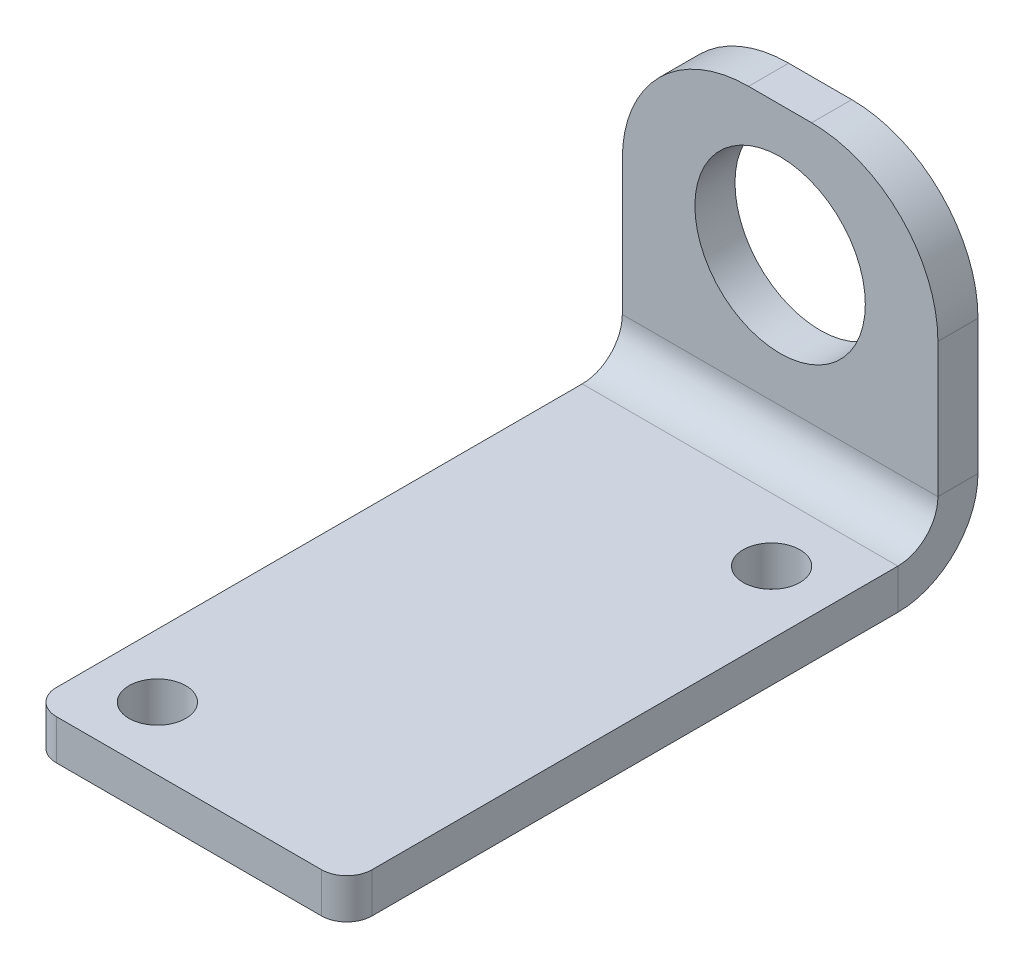
ISO-10303-21;
HEADER;
FILE_DESCRIPTION(('STEP AP214'),'2;1');
FILE_NAME('part.step','',(''),(''),'','','');
FILE_SCHEMA(('AUTOMOTIVE_DESIGN { 1 0 10303 214 1 1 1 1 }'));
ENDSEC;
DATA;
#1=APPLICATION_CONTEXT('core data for automotive mechanical design processes');
#2=APPLICATION_PROTOCOL_DEFINITION('international standard','automotive_design',2000,#1);
#3=PRODUCT_CONTEXT('',#1,'mechanical');
#4=PRODUCT('Part','Part','',(#3));
#5=PRODUCT_RELATED_PRODUCT_CATEGORY('part','',(#4));
#6=PRODUCT_DEFINITION_FORMATION('','',#4);
#7=PRODUCT_DEFINITION_CONTEXT('part definition',#1,'design');
#8=PRODUCT_DEFINITION('design','',#6,#7);
#9=PRODUCT_DEFINITION_SHAPE('','',#8);
#10=(LENGTH_UNIT() NAMED_UNIT(*) SI_UNIT(.MILLI.,.METRE.));
#11=(NAMED_UNIT(*) PLANE_ANGLE_UNIT() SI_UNIT($,.RADIAN.));
#12=(NAMED_UNIT(*) SI_UNIT($,.STERADIAN.) SOLID_ANGLE_UNIT());
#13=UNCERTAINTY_MEASURE_WITH_UNIT(LENGTH_MEASURE(1.E-05),#10,'distance_accuracy_value','');
#14=(GEOMETRIC_REPRESENTATION_CONTEXT(3) GLOBAL_UNCERTAINTY_ASSIGNED_CONTEXT((#13)) GLOBAL_UNIT_ASSIGNED_CONTEXT((#10,
#11,#12)) REPRESENTATION_CONTEXT('',''));
#15=CARTESIAN_POINT('',(0.,0.,0.));
#16=DIRECTION('',(0.,0.,1.));
#17=DIRECTION('',(1.,0.,0.));
#18=AXIS2_PLACEMENT_3D('',#15,#16,#17);
#19=CARTESIAN_POINT('',(-12.5,-3.175,0.));
#20=DIRECTION('',(-1.,0.,0.));
#21=DIRECTION('',(0.,0.,1.));
#22=AXIS2_PLACEMENT_3D('',#19,#20,#21);
#23=PLANE('',#22);
#24=DIRECTION('',(0.,0.,1.));
#25=VECTOR('',#24,1.);
#26=CARTESIAN_POINT('',(-12.5,-3.175,0.));
#27=LINE('',#26,#25);
#28=CARTESIAN_POINT('',(-12.5,-3.17500000000003,-43.65));
#29=VERTEX_POINT('',#28);
#30=CARTESIAN_POINT('',(-12.5,-3.175,-2.));
#31=VERTEX_POINT('',#30);
#32=EDGE_CURVE('E222',#29,#31,#27,.T.);
#33=ORIENTED_EDGE('',*,*,#32,.T.);
#34=DIRECTION('',(0.,1.,0.));
#35=VECTOR('',#34,1.);
#36=CARTESIAN_POINT('',(-12.5,-3.175,-2.));
#37=LINE('',#36,#35);
#38=CARTESIAN_POINT('',(-12.5,0.,-2.));
#39=VERTEX_POINT('',#38);
#40=EDGE_CURVE('E13',#31,#39,#37,.T.);
#41=ORIENTED_EDGE('',*,*,#40,.T.);
#42=DIRECTION('',(0.,0.,1.));
#43=VECTOR('',#42,1.);
#44=CARTESIAN_POINT('',(-12.5,0.,0.));
#45=LINE('',#44,#43);
#46=CARTESIAN_POINT('',(-12.5,0.,-43.65));
#47=VERTEX_POINT('',#46);
#48=EDGE_CURVE('E220',#47,#39,#45,.T.);
#49=ORIENTED_EDGE('',*,*,#48,.F.);
#50=DIRECTION('',(0.,-1.,0.));
#51=VECTOR('',#50,1.);
#52=CARTESIAN_POINT('',(-12.5,0.,-43.65));
#53=LINE('',#52,#51);
#54=EDGE_CURVE('E209',#47,#29,#53,.T.);
#55=ORIENTED_EDGE('',*,*,#54,.T.);
#56=EDGE_LOOP('',(#33,#41,#49,#55));
#57=FACE_BOUND('',#56,.T.);
#58=ADVANCED_FACE('F61',(#57),#23,.T.);
#59=CARTESIAN_POINT('',(0.,-3.175,0.));
#60=DIRECTION('',(0.,-1.,0.));
#61=DIRECTION('',(0.,0.,-1.));
#62=AXIS2_PLACEMENT_3D('',#59,#60,#61);
#63=PLANE('',#62);
#64=CARTESIAN_POINT('',(-7.5,-3.17500000000003,-5.));
#65=DIRECTION('',(0.,1.,0.));
#66=DIRECTION('',(0.,0.,1.));
#67=AXIS2_PLACEMENT_3D('',#64,#65,#66);
#68=CIRCLE('',#67,2.25);
#69=CARTESIAN_POINT('',(-7.5,-3.17500000000003,-2.75));
#70=VERTEX_POINT('',#69);
#71=EDGE_CURVE('E317',#70,#70,#68,.T.);
#72=ORIENTED_EDGE('',*,*,#71,.T.);
#73=EDGE_LOOP('',(#72));
#74=FACE_BOUND('',#73,.T.);
#75=CARTESIAN_POINT('',(7.5,-3.17500000000003,-38.65));
#76=DIRECTION('',(0.,1.,0.));
#77=DIRECTION('',(0.,0.,1.));
#78=AXIS2_PLACEMENT_3D('',#75,#76,#77);
#79=CIRCLE('',#78,2.25);
#80=CARTESIAN_POINT('',(7.5,-3.17500000000003,-36.4));
#81=VERTEX_POINT('',#80);
#82=EDGE_CURVE('E311',#81,#81,#79,.T.);
#83=ORIENTED_EDGE('',*,*,#82,.T.);
#84=EDGE_LOOP('',(#83));
#85=FACE_BOUND('',#84,.T.);
#86=DIRECTION('',(0.,0.,-1.));
#87=VECTOR('',#86,1.);
#88=CARTESIAN_POINT('',(12.5,-3.175,0.));
#89=LINE('',#88,#87);
#90=CARTESIAN_POINT('',(12.5,-3.175,-2.));
#91=VERTEX_POINT('',#90);
#92=CARTESIAN_POINT('',(12.5,-3.175,-43.65));
#93=VERTEX_POINT('',#92);
#94=EDGE_CURVE('E228',#91,#93,#89,.T.);
#95=ORIENTED_EDGE('',*,*,#94,.F.);
#96=CARTESIAN_POINT('',(10.5,-3.175,-2.));
#97=DIRECTION('',(0.,-1.,0.));
#98=DIRECTION('',(0.,0.,-1.));
#99=AXIS2_PLACEMENT_3D('',#96,#97,#98);
#100=CIRCLE('',#99,2.);
#101=CARTESIAN_POINT('',(10.5,-3.175,0.));
#102=VERTEX_POINT('',#101);
#103=EDGE_CURVE('E69',#91,#102,#100,.T.);
#104=ORIENTED_EDGE('',*,*,#103,.T.);
#105=DIRECTION('',(1.,0.,0.));
#106=VECTOR('',#105,1.);
#107=CARTESIAN_POINT('',(-12.5,-3.175,0.));
#108=LINE('',#107,#106);
#109=CARTESIAN_POINT('',(-10.5,-3.175,0.));
#110=VERTEX_POINT('',#109);
#111=EDGE_CURVE('E224',#110,#102,#108,.T.);
#112=ORIENTED_EDGE('',*,*,#111,.F.);
#113=CARTESIAN_POINT('',(-10.5,-3.175,-2.));
#114=DIRECTION('',(0.,-1.,0.));
#115=DIRECTION('',(0.,0.,-1.));
#116=AXIS2_PLACEMENT_3D('',#113,#114,#115);
#117=CIRCLE('',#116,2.);
#118=EDGE_CURVE('E76',#110,#31,#117,.T.);
#119=ORIENTED_EDGE('',*,*,#118,.T.);
#120=ORIENTED_EDGE('',*,*,#32,.F.);
#121=DIRECTION('',(-1.,0.,0.));
#122=VECTOR('',#121,1.);
#123=CARTESIAN_POINT('',(-12.5,-3.17500000000003,-43.65));
#124=LINE('',#123,#122);
#125=EDGE_CURVE('E161',#29,#93,#124,.F.);
#126=ORIENTED_EDGE('',*,*,#125,.T.);
#127=EDGE_LOOP('',(#95,#104,#112,#119,#120,#126));
#128=FACE_BOUND('',#127,.T.);
#129=ADVANCED_FACE('F264',(#74,#85,#128),#63,.T.);
#130=CARTESIAN_POINT('',(0.,0.,0.));
#131=DIRECTION('',(0.,-1.,0.));
#132=DIRECTION('',(0.,0.,-1.));
#133=AXIS2_PLACEMENT_3D('',#130,#131,#132);
#134=PLANE('',#133);
#135=CARTESIAN_POINT('',(-7.5,0.,-5.));
#136=DIRECTION('',(0.,1.,0.));
#137=DIRECTION('',(0.,0.,1.));
#138=AXIS2_PLACEMENT_3D('',#135,#136,#137);
#139=CIRCLE('',#138,2.25);
#140=CARTESIAN_POINT('',(-7.5,0.,-2.75));
#141=VERTEX_POINT('',#140);
#142=EDGE_CURVE('E320',#141,#141,#139,.T.);
#143=ORIENTED_EDGE('',*,*,#142,.F.);
#144=EDGE_LOOP('',(#143));
#145=FACE_BOUND('',#144,.T.);
#146=CARTESIAN_POINT('',(7.5,0.,-38.65));
#147=DIRECTION('',(0.,1.,0.));
#148=DIRECTION('',(0.,0.,1.));
#149=AXIS2_PLACEMENT_3D('',#146,#147,#148);
#150=CIRCLE('',#149,2.25);
#151=CARTESIAN_POINT('',(7.5,0.,-36.4));
#152=VERTEX_POINT('',#151);
#153=EDGE_CURVE('E314',#152,#152,#150,.T.);
#154=ORIENTED_EDGE('',*,*,#153,.F.);
#155=EDGE_LOOP('',(#154));
#156=FACE_BOUND('',#155,.T.);
#157=DIRECTION('',(1.,0.,0.));
#158=VECTOR('',#157,1.);
#159=CARTESIAN_POINT('',(-12.5,0.,0.));
#160=LINE('',#159,#158);
#161=CARTESIAN_POINT('',(-10.5,0.,0.));
#162=VERTEX_POINT('',#161);
#163=CARTESIAN_POINT('',(10.5,0.,0.));
#164=VERTEX_POINT('',#163);
#165=EDGE_CURVE('E233',#162,#164,#160,.T.);
#166=ORIENTED_EDGE('',*,*,#165,.T.);
#167=CARTESIAN_POINT('',(10.5,0.,-2.));
#168=DIRECTION('',(0.,-1.,0.));
#169=DIRECTION('',(0.,0.,-1.));
#170=AXIS2_PLACEMENT_3D('',#167,#168,#169);
#171=CIRCLE('',#170,2.);
#172=CARTESIAN_POINT('',(12.5,0.,-2.));
#173=VERTEX_POINT('',#172);
#174=EDGE_CURVE('E260',#164,#173,#171,.F.);
#175=ORIENTED_EDGE('',*,*,#174,.T.);
#176=DIRECTION('',(0.,0.,-1.));
#177=VECTOR('',#176,1.);
#178=CARTESIAN_POINT('',(12.5,0.,0.));
#179=LINE('',#178,#177);
#180=CARTESIAN_POINT('',(12.5,0.,-43.65));
#181=VERTEX_POINT('',#180);
#182=EDGE_CURVE('E225',#173,#181,#179,.T.);
#183=ORIENTED_EDGE('',*,*,#182,.T.);
#184=DIRECTION('',(-1.,0.,0.));
#185=VECTOR('',#184,1.);
#186=CARTESIAN_POINT('',(-12.5,0.,-43.65));
#187=LINE('',#186,#185);
#188=EDGE_CURVE('E213',#47,#181,#187,.F.);
#189=ORIENTED_EDGE('',*,*,#188,.F.);
#190=ORIENTED_EDGE('',*,*,#48,.T.);
#191=CARTESIAN_POINT('',(-10.5,0.,-2.));
#192=DIRECTION('',(0.,-1.,0.));
#193=DIRECTION('',(0.,0.,-1.));
#194=AXIS2_PLACEMENT_3D('',#191,#192,#193);
#195=CIRCLE('',#194,2.);
#196=EDGE_CURVE('E258',#39,#162,#195,.F.);
#197=ORIENTED_EDGE('',*,*,#196,.T.);
#198=EDGE_LOOP('',(#166,#175,#183,#189,#190,#197));
#199=FACE_BOUND('',#198,.T.);
#200=ADVANCED_FACE('F273',(#145,#156,#199),#134,.F.);
#201=CARTESIAN_POINT('',(12.5,-3.175,0.));
#202=DIRECTION('',(1.,0.,0.));
#203=DIRECTION('',(0.,0.,-1.));
#204=AXIS2_PLACEMENT_3D('',#201,#202,#203);
#205=PLANE('',#204);
#206=ORIENTED_EDGE('',*,*,#182,.F.);
#207=DIRECTION('',(0.,1.,0.));
#208=VECTOR('',#207,1.);
#209=CARTESIAN_POINT('',(12.5,-3.175,-2.));
#210=LINE('',#209,#208);
#211=EDGE_CURVE('E84',#173,#91,#210,.F.);
#212=ORIENTED_EDGE('',*,*,#211,.T.);
#213=ORIENTED_EDGE('',*,*,#94,.T.);
#214=DIRECTION('',(0.,-1.,0.));
#215=VECTOR('',#214,1.);
#216=CARTESIAN_POINT('',(12.5,0.,-43.65));
#217=LINE('',#216,#215);
#218=EDGE_CURVE('E217',#181,#93,#217,.T.);
#219=ORIENTED_EDGE('',*,*,#218,.F.);
#220=EDGE_LOOP('',(#206,#212,#213,#219));
#221=FACE_BOUND('',#220,.T.);
#222=ADVANCED_FACE('F276',(#221),#205,.T.);
#223=CARTESIAN_POINT('',(-12.5,-3.175,0.));
#224=DIRECTION('',(0.,0.,1.));
#225=DIRECTION('',(1.,0.,0.));
#226=AXIS2_PLACEMENT_3D('',#223,#224,#225);
#227=PLANE('',#226);
#228=ORIENTED_EDGE('',*,*,#111,.T.);
#229=DIRECTION('',(0.,1.,0.));
#230=VECTOR('',#229,1.);
#231=CARTESIAN_POINT('',(10.5,-3.175,0.));
#232=LINE('',#231,#230);
#233=EDGE_CURVE('E255',#102,#164,#232,.T.);
#234=ORIENTED_EDGE('',*,*,#233,.T.);
#235=ORIENTED_EDGE('',*,*,#165,.F.);
#236=DIRECTION('',(0.,1.,0.));
#237=VECTOR('',#236,1.);
#238=CARTESIAN_POINT('',(-10.5,-3.175,0.));
#239=LINE('',#238,#237);
#240=EDGE_CURVE('E253',#162,#110,#239,.F.);
#241=ORIENTED_EDGE('',*,*,#240,.T.);
#242=EDGE_LOOP('',(#228,#234,#235,#241));
#243=FACE_BOUND('',#242,.T.);
#244=ADVANCED_FACE('F268',(#243),#227,.T.);
#245=CARTESIAN_POINT('',(12.5,3.17499999999997,-43.65));
#246=DIRECTION('',(1.,0.,0.));
#247=DIRECTION('',(0.,0.,-1.));
#248=AXIS2_PLACEMENT_3D('',#245,#246,#247);
#249=PLANE('',#248);
#250=DIRECTION('',(0.,0.,1.));
#251=VECTOR('',#250,1.);
#252=CARTESIAN_POINT('',(12.5,3.17500000000001,-50.));
#253=LINE('',#252,#251);
#254=CARTESIAN_POINT('',(12.5,3.17499999999996,-46.825));
#255=VERTEX_POINT('',#254);
#256=CARTESIAN_POINT('',(12.5,3.17499999999995,-50.));
#257=VERTEX_POINT('',#256);
#258=EDGE_CURVE('E203',#255,#257,#253,.F.);
#259=ORIENTED_EDGE('',*,*,#258,.F.);
#260=CARTESIAN_POINT('',(12.5,3.17499999999997,-43.65));
#261=DIRECTION('',(-1.,0.,0.));
#262=DIRECTION('',(0.,0.,1.));
#263=AXIS2_PLACEMENT_3D('',#260,#261,#262);
#264=CIRCLE('',#263,3.175);
#265=EDGE_CURVE('E164',#181,#255,#264,.F.);
#266=ORIENTED_EDGE('',*,*,#265,.F.);
#267=ORIENTED_EDGE('',*,*,#218,.T.);
#268=CARTESIAN_POINT('',(12.5,3.17499999999997,-43.65));
#269=DIRECTION('',(-1.,0.,0.));
#270=DIRECTION('',(0.,0.,1.));
#271=AXIS2_PLACEMENT_3D('',#268,#269,#270);
#272=CIRCLE('',#271,6.35);
#273=EDGE_CURVE('E208',#93,#257,#272,.F.);
#274=ORIENTED_EDGE('',*,*,#273,.T.);
#275=EDGE_LOOP('',(#259,#266,#267,#274));
#276=FACE_BOUND('',#275,.T.);
#277=ADVANCED_FACE('F280',(#276),#249,.T.);
#278=CARTESIAN_POINT('',(-12.5,3.17499999999997,-43.65));
#279=DIRECTION('',(1.,0.,0.));
#280=DIRECTION('',(0.,0.,-1.));
#281=AXIS2_PLACEMENT_3D('',#278,#279,#280);
#282=PLANE('',#281);
#283=CARTESIAN_POINT('',(-12.5,3.17499999999997,-43.65));
#284=DIRECTION('',(-1.,0.,0.));
#285=DIRECTION('',(0.,0.,1.));
#286=AXIS2_PLACEMENT_3D('',#283,#284,#285);
#287=CIRCLE('',#286,3.175);
#288=CARTESIAN_POINT('',(-12.5,3.17499999999996,-46.825));
#289=VERTEX_POINT('',#288);
#290=EDGE_CURVE('E171',#289,#47,#287,.T.);
#291=ORIENTED_EDGE('',*,*,#290,.F.);
#292=DIRECTION('',(0.,0.,1.));
#293=VECTOR('',#292,1.);
#294=CARTESIAN_POINT('',(-12.5,3.17499999999999,-46.825));
#295=LINE('',#294,#293);
#296=CARTESIAN_POINT('',(-12.5,3.17500000000001,-50.));
#297=VERTEX_POINT('',#296);
#298=EDGE_CURVE('E168',#289,#297,#295,.F.);
#299=ORIENTED_EDGE('',*,*,#298,.T.);
#300=CARTESIAN_POINT('',(-12.5,3.17499999999997,-43.65));
#301=DIRECTION('',(-1.,0.,0.));
#302=DIRECTION('',(0.,0.,1.));
#303=AXIS2_PLACEMENT_3D('',#300,#301,#302);
#304=CIRCLE('',#303,6.35);
#305=EDGE_CURVE('E153',#297,#29,#304,.T.);
#306=ORIENTED_EDGE('',*,*,#305,.T.);
#307=ORIENTED_EDGE('',*,*,#54,.F.);
#308=EDGE_LOOP('',(#291,#299,#306,#307));
#309=FACE_BOUND('',#308,.T.);
#310=ADVANCED_FACE('F169',(#309),#282,.F.);
#311=CARTESIAN_POINT('',(-12.5,3.17499999999997,-43.65));
#312=DIRECTION('',(-1.,0.,0.));
#313=DIRECTION('',(0.,0.,-1.));
#314=AXIS2_PLACEMENT_3D('',#311,#312,#313);
#315=CYLINDRICAL_SURFACE('',#314,6.35);
#316=ORIENTED_EDGE('',*,*,#125,.F.);
#317=ORIENTED_EDGE('',*,*,#305,.F.);
#318=DIRECTION('',(-1.,0.,0.));
#319=VECTOR('',#318,1.);
#320=CARTESIAN_POINT('',(12.5,3.17500000000001,-50.));
#321=LINE('',#320,#319);
#322=EDGE_CURVE('E158',#297,#257,#321,.F.);
#323=ORIENTED_EDGE('',*,*,#322,.T.);
#324=ORIENTED_EDGE('',*,*,#273,.F.);
#325=EDGE_LOOP('',(#316,#317,#323,#324));
#326=FACE_BOUND('',#325,.T.);
#327=ADVANCED_FACE('F155',(#326),#315,.T.);
#328=CARTESIAN_POINT('',(-12.5,3.17499999999997,-43.65));
#329=DIRECTION('',(-1.,0.,0.));
#330=DIRECTION('',(0.,0.,-1.));
#331=AXIS2_PLACEMENT_3D('',#328,#329,#330);
#332=CYLINDRICAL_SURFACE('',#331,3.175);
#333=ORIENTED_EDGE('',*,*,#188,.T.);
#334=ORIENTED_EDGE('',*,*,#265,.T.);
#335=DIRECTION('',(-1.,0.,0.));
#336=VECTOR('',#335,1.);
#337=CARTESIAN_POINT('',(12.5,3.17499999999999,-46.825));
#338=LINE('',#337,#336);
#339=EDGE_CURVE('E176',#255,#289,#338,.T.);
#340=ORIENTED_EDGE('',*,*,#339,.T.);
#341=ORIENTED_EDGE('',*,*,#290,.T.);
#342=EDGE_LOOP('',(#333,#334,#340,#341));
#343=FACE_BOUND('',#342,.T.);
#344=ADVANCED_FACE('F286',(#343),#332,.F.);
#345=CARTESIAN_POINT('',(-12.5,23.825,-50.0000000000001));
#346=DIRECTION('',(1.,0.,0.));
#347=DIRECTION('',(0.,1.,0.));
#348=AXIS2_PLACEMENT_3D('',#345,#346,#347);
#349=PLANE('',#348);
#350=DIRECTION('',(0.,-1.,0.));
#351=VECTOR('',#350,1.);
#352=CARTESIAN_POINT('',(-12.5,23.825,-46.8250000000001));
#353=LINE('',#352,#351);
#354=CARTESIAN_POINT('',(-12.5,13.825,-46.8250000000001));
#355=VERTEX_POINT('',#354);
#356=EDGE_CURVE('E185',#289,#355,#353,.F.);
#357=ORIENTED_EDGE('',*,*,#356,.T.);
#358=DIRECTION('',(0.,0.,1.));
#359=VECTOR('',#358,1.);
#360=CARTESIAN_POINT('',(-12.5,13.825,-50.));
#361=LINE('',#360,#359);
#362=CARTESIAN_POINT('',(-12.5,13.825,-50.));
#363=VERTEX_POINT('',#362);
#364=EDGE_CURVE('E189',#355,#363,#361,.F.);
#365=ORIENTED_EDGE('',*,*,#364,.T.);
#366=DIRECTION('',(0.,1.,0.));
#367=VECTOR('',#366,1.);
#368=CARTESIAN_POINT('',(-12.5,-1.84011717907487E-13,-50.));
#369=LINE('',#368,#367);
#370=EDGE_CURVE('E181',#297,#363,#369,.T.);
#371=ORIENTED_EDGE('',*,*,#370,.F.);
#372=ORIENTED_EDGE('',*,*,#298,.F.);
#373=EDGE_LOOP('',(#357,#365,#371,#372));
#374=FACE_BOUND('',#373,.T.);
#375=ADVANCED_FACE('F187',(#374),#349,.F.);
#376=CARTESIAN_POINT('',(12.5,0.,-50.));
#377=DIRECTION('',(-1.,0.,0.));
#378=DIRECTION('',(0.,-1.,0.));
#379=AXIS2_PLACEMENT_3D('',#376,#377,#378);
#380=PLANE('',#379);
#381=DIRECTION('',(0.,-1.,0.));
#382=VECTOR('',#381,1.);
#383=CARTESIAN_POINT('',(12.5,-1.87652270847627E-13,-50.));
#384=LINE('',#383,#382);
#385=CARTESIAN_POINT('',(12.5,13.825,-50.));
#386=VERTEX_POINT('',#385);
#387=EDGE_CURVE('E184',#386,#257,#384,.T.);
#388=ORIENTED_EDGE('',*,*,#387,.F.);
#389=DIRECTION('',(0.,0.,1.));
#390=VECTOR('',#389,1.);
#391=CARTESIAN_POINT('',(12.5,13.825,-50.));
#392=LINE('',#391,#390);
#393=CARTESIAN_POINT('',(12.5,13.825,-46.8250000000001));
#394=VERTEX_POINT('',#393);
#395=EDGE_CURVE('E250',#386,#394,#392,.T.);
#396=ORIENTED_EDGE('',*,*,#395,.T.);
#397=DIRECTION('',(0.,1.,0.));
#398=VECTOR('',#397,1.);
#399=CARTESIAN_POINT('',(12.5,0.,-46.825));
#400=LINE('',#399,#398);
#401=EDGE_CURVE('E191',#394,#255,#400,.F.);
#402=ORIENTED_EDGE('',*,*,#401,.T.);
#403=ORIENTED_EDGE('',*,*,#258,.T.);
#404=EDGE_LOOP('',(#388,#396,#402,#403));
#405=FACE_BOUND('',#404,.T.);
#406=ADVANCED_FACE('F304',(#405),#380,.F.);
#407=CARTESIAN_POINT('',(0.,-1.85831994377557E-13,-50.));
#408=DIRECTION('',(0.,0.,1.));
#409=DIRECTION('',(0.,-1.,0.));
#410=AXIS2_PLACEMENT_3D('',#407,#408,#409);
#411=PLANE('',#410);
#412=CARTESIAN_POINT('',(0.,13.5,-50.));
#413=DIRECTION('',(0.,0.,-1.));
#414=DIRECTION('',(0.,1.,0.));
#415=AXIS2_PLACEMENT_3D('',#412,#413,#414);
#416=CIRCLE('',#415,6.74999999999999);
#417=CARTESIAN_POINT('',(0.,20.25,-50.0000000000001));
#418=VERTEX_POINT('',#417);
#419=EDGE_CURVE('E308',#418,#418,#416,.T.);
#420=ORIENTED_EDGE('',*,*,#419,.F.);
#421=EDGE_LOOP('',(#420));
#422=FACE_BOUND('',#421,.T.);
#423=ORIENTED_EDGE('',*,*,#370,.T.);
#424=CARTESIAN_POINT('',(-2.5,13.825,-50.));
#425=DIRECTION('',(0.,0.,1.));
#426=DIRECTION('',(0.,-1.,0.));
#427=AXIS2_PLACEMENT_3D('',#424,#425,#426);
#428=CIRCLE('',#427,10.);
#429=CARTESIAN_POINT('',(-2.5,23.825,-50.0000000000001));
#430=VERTEX_POINT('',#429);
#431=EDGE_CURVE('E248',#363,#430,#428,.F.);
#432=ORIENTED_EDGE('',*,*,#431,.T.);
#433=DIRECTION('',(1.,0.,0.));
#434=VECTOR('',#433,1.);
#435=CARTESIAN_POINT('',(0.,23.825,-50.0000000000001));
#436=LINE('',#435,#434);
#437=CARTESIAN_POINT('',(2.5,23.825,-50.0000000000001));
#438=VERTEX_POINT('',#437);
#439=EDGE_CURVE('E190',#430,#438,#436,.T.);
#440=ORIENTED_EDGE('',*,*,#439,.T.);
#441=CARTESIAN_POINT('',(2.5,13.825,-50.));
#442=DIRECTION('',(0.,0.,1.));
#443=DIRECTION('',(0.,-1.,0.));
#444=AXIS2_PLACEMENT_3D('',#441,#442,#443);
#445=CIRCLE('',#444,10.);
#446=EDGE_CURVE('E246',#438,#386,#445,.F.);
#447=ORIENTED_EDGE('',*,*,#446,.T.);
#448=ORIENTED_EDGE('',*,*,#387,.T.);
#449=ORIENTED_EDGE('',*,*,#322,.F.);
#450=EDGE_LOOP('',(#423,#432,#440,#447,#448,#449));
#451=FACE_BOUND('',#450,.T.);
#452=ADVANCED_FACE('F180',(#422,#451),#411,.F.);
#453=CARTESIAN_POINT('',(0.,-1.7474654112673E-13,-46.825));
#454=DIRECTION('',(0.,0.,1.));
#455=DIRECTION('',(0.,-1.,0.));
#456=AXIS2_PLACEMENT_3D('',#453,#454,#455);
#457=PLANE('',#456);
#458=CARTESIAN_POINT('',(0.,13.5,-46.8250000000001));
#459=DIRECTION('',(0.,0.,1.));
#460=DIRECTION('',(0.,-1.,0.));
#461=AXIS2_PLACEMENT_3D('',#458,#459,#460);
#462=CIRCLE('',#461,6.74999999999999);
#463=CARTESIAN_POINT('',(0.,6.75000000000003,-46.825));
#464=VERTEX_POINT('',#463);
#465=EDGE_CURVE('E206',#464,#464,#462,.T.);
#466=ORIENTED_EDGE('',*,*,#465,.F.);
#467=EDGE_LOOP('',(#466));
#468=FACE_BOUND('',#467,.T.);
#469=DIRECTION('',(-1.,0.,0.));
#470=VECTOR('',#469,1.);
#471=CARTESIAN_POINT('',(12.5,23.825,-46.8250000000001));
#472=LINE('',#471,#470);
#473=CARTESIAN_POINT('',(-2.5,23.825,-46.8250000000001));
#474=VERTEX_POINT('',#473);
#475=CARTESIAN_POINT('',(2.5,23.825,-46.8250000000001));
#476=VERTEX_POINT('',#475);
#477=EDGE_CURVE('E195',#474,#476,#472,.F.);
#478=ORIENTED_EDGE('',*,*,#477,.F.);
#479=CARTESIAN_POINT('',(-2.5,13.825,-46.8250000000001));
#480=DIRECTION('',(0.,0.,1.));
#481=DIRECTION('',(0.,-1.,0.));
#482=AXIS2_PLACEMENT_3D('',#479,#480,#481);
#483=CIRCLE('',#482,10.);
#484=EDGE_CURVE('E243',#474,#355,#483,.T.);
#485=ORIENTED_EDGE('',*,*,#484,.T.);
#486=ORIENTED_EDGE('',*,*,#356,.F.);
#487=ORIENTED_EDGE('',*,*,#339,.F.);
#488=ORIENTED_EDGE('',*,*,#401,.F.);
#489=CARTESIAN_POINT('',(2.5,13.825,-46.8250000000001));
#490=DIRECTION('',(0.,0.,1.));
#491=DIRECTION('',(0.,-1.,0.));
#492=AXIS2_PLACEMENT_3D('',#489,#490,#491);
#493=CIRCLE('',#492,10.);
#494=EDGE_CURVE('E241',#394,#476,#493,.T.);
#495=ORIENTED_EDGE('',*,*,#494,.T.);
#496=EDGE_LOOP('',(#478,#485,#486,#487,#488,#495));
#497=FACE_BOUND('',#496,.T.);
#498=ADVANCED_FACE('F291',(#468,#497),#457,.T.);
#499=CARTESIAN_POINT('',(12.5,23.825,-50.0000000000001));
#500=DIRECTION('',(0.,-1.,0.));
#501=DIRECTION('',(0.,0.,-1.));
#502=AXIS2_PLACEMENT_3D('',#499,#500,#501);
#503=PLANE('',#502);
#504=ORIENTED_EDGE('',*,*,#439,.F.);
#505=DIRECTION('',(0.,0.,1.));
#506=VECTOR('',#505,1.);
#507=CARTESIAN_POINT('',(-2.5,23.825,-50.0000000000001));
#508=LINE('',#507,#506);
#509=EDGE_CURVE('E238',#430,#474,#508,.T.);
#510=ORIENTED_EDGE('',*,*,#509,.T.);
#511=ORIENTED_EDGE('',*,*,#477,.T.);
#512=DIRECTION('',(0.,0.,1.));
#513=VECTOR('',#512,1.);
#514=CARTESIAN_POINT('',(2.5,23.825,-50.0000000000001));
#515=LINE('',#514,#513);
#516=EDGE_CURVE('E230',#476,#438,#515,.F.);
#517=ORIENTED_EDGE('',*,*,#516,.T.);
#518=EDGE_LOOP('',(#504,#510,#511,#517));
#519=FACE_BOUND('',#518,.T.);
#520=ADVANCED_FACE('F298',(#519),#503,.F.);
#521=CARTESIAN_POINT('',(0.,13.5,-50.));
#522=DIRECTION('',(0.,0.,-1.));
#523=DIRECTION('',(0.,1.,0.));
#524=AXIS2_PLACEMENT_3D('',#521,#522,#523);
#525=CYLINDRICAL_SURFACE('',#524,6.74999999999999);
#526=ORIENTED_EDGE('',*,*,#465,.T.);
#527=EDGE_LOOP('',(#526));
#528=FACE_BOUND('',#527,.T.);
#529=ORIENTED_EDGE('',*,*,#419,.T.);
#530=EDGE_LOOP('',(#529));
#531=FACE_BOUND('',#530,.T.);
#532=ADVANCED_FACE('F333',(#528,#531),#525,.F.);
#533=CARTESIAN_POINT('',(7.5,0.,-38.65));
#534=DIRECTION('',(0.,1.,0.));
#535=DIRECTION('',(0.,0.,1.));
#536=AXIS2_PLACEMENT_3D('',#533,#534,#535);
#537=CYLINDRICAL_SURFACE('',#536,2.25);
#538=ORIENTED_EDGE('',*,*,#82,.F.);
#539=EDGE_LOOP('',(#538));
#540=FACE_BOUND('',#539,.T.);
#541=ORIENTED_EDGE('',*,*,#153,.T.);
#542=EDGE_LOOP('',(#541));
#543=FACE_BOUND('',#542,.T.);
#544=ADVANCED_FACE('F331',(#540,#543),#537,.F.);
#545=CARTESIAN_POINT('',(-7.5,0.,-5.));
#546=DIRECTION('',(0.,1.,0.));
#547=DIRECTION('',(0.,0.,1.));
#548=AXIS2_PLACEMENT_3D('',#545,#546,#547);
#549=CYLINDRICAL_SURFACE('',#548,2.25);
#550=ORIENTED_EDGE('',*,*,#71,.F.);
#551=EDGE_LOOP('',(#550));
#552=FACE_BOUND('',#551,.T.);
#553=ORIENTED_EDGE('',*,*,#142,.T.);
#554=EDGE_LOOP('',(#553));
#555=FACE_BOUND('',#554,.T.);
#556=ADVANCED_FACE('F324',(#552,#555),#549,.F.);
#557=CARTESIAN_POINT('',(-2.5,13.825,-50.));
#558=DIRECTION('',(0.,0.,1.));
#559=DIRECTION('',(0.,-1.,0.));
#560=AXIS2_PLACEMENT_3D('',#557,#558,#559);
#561=CYLINDRICAL_SURFACE('',#560,10.);
#562=ORIENTED_EDGE('',*,*,#431,.F.);
#563=ORIENTED_EDGE('',*,*,#364,.F.);
#564=ORIENTED_EDGE('',*,*,#484,.F.);
#565=ORIENTED_EDGE('',*,*,#509,.F.);
#566=EDGE_LOOP('',(#562,#563,#564,#565));
#567=FACE_BOUND('',#566,.T.);
#568=ADVANCED_FACE('F293',(#567),#561,.T.);
#569=CARTESIAN_POINT('',(2.5,13.825,-50.));
#570=DIRECTION('',(0.,0.,1.));
#571=DIRECTION('',(0.,-1.,0.));
#572=AXIS2_PLACEMENT_3D('',#569,#570,#571);
#573=CYLINDRICAL_SURFACE('',#572,10.);
#574=ORIENTED_EDGE('',*,*,#446,.F.);
#575=ORIENTED_EDGE('',*,*,#516,.F.);
#576=ORIENTED_EDGE('',*,*,#494,.F.);
#577=ORIENTED_EDGE('',*,*,#395,.F.);
#578=EDGE_LOOP('',(#574,#575,#576,#577));
#579=FACE_BOUND('',#578,.T.);
#580=ADVANCED_FACE('F301',(#579),#573,.T.);
#581=CARTESIAN_POINT('',(10.5,-3.175,-2.));
#582=DIRECTION('',(0.,1.,0.));
#583=DIRECTION('',(0.,0.,1.));
#584=AXIS2_PLACEMENT_3D('',#581,#582,#583);
#585=CYLINDRICAL_SURFACE('',#584,2.);
#586=ORIENTED_EDGE('',*,*,#103,.F.);
#587=ORIENTED_EDGE('',*,*,#211,.F.);
#588=ORIENTED_EDGE('',*,*,#174,.F.);
#589=ORIENTED_EDGE('',*,*,#233,.F.);
#590=EDGE_LOOP('',(#586,#587,#588,#589));
#591=FACE_BOUND('',#590,.T.);
#592=ADVANCED_FACE('F271',(#591),#585,.T.);
#593=CARTESIAN_POINT('',(-10.5,-3.175,-2.));
#594=DIRECTION('',(0.,1.,0.));
#595=DIRECTION('',(0.,0.,1.));
#596=AXIS2_PLACEMENT_3D('',#593,#594,#595);
#597=CYLINDRICAL_SURFACE('',#596,2.);
#598=ORIENTED_EDGE('',*,*,#118,.F.);
#599=ORIENTED_EDGE('',*,*,#240,.F.);
#600=ORIENTED_EDGE('',*,*,#196,.F.);
#601=ORIENTED_EDGE('',*,*,#40,.F.);
#602=EDGE_LOOP('',(#598,#599,#600,#601));
#603=FACE_BOUND('',#602,.T.);
#604=ADVANCED_FACE('F63',(#603),#597,.T.);
#605=CLOSED_SHELL('',(#58,#129,#200,#222,#244,#277,#310,#327,#344,#375,#406,#452,#498,#520,#532,
#544,#556,#568,#580,#592,#604));
#606=MANIFOLD_SOLID_BREP('B2',#605);
#607=ADVANCED_BREP_SHAPE_REPRESENTATION('',(#18,#606),#14);
#608=SHAPE_DEFINITION_REPRESENTATION(#9,#607);
ENDSEC;
END-ISO-10303-21;
